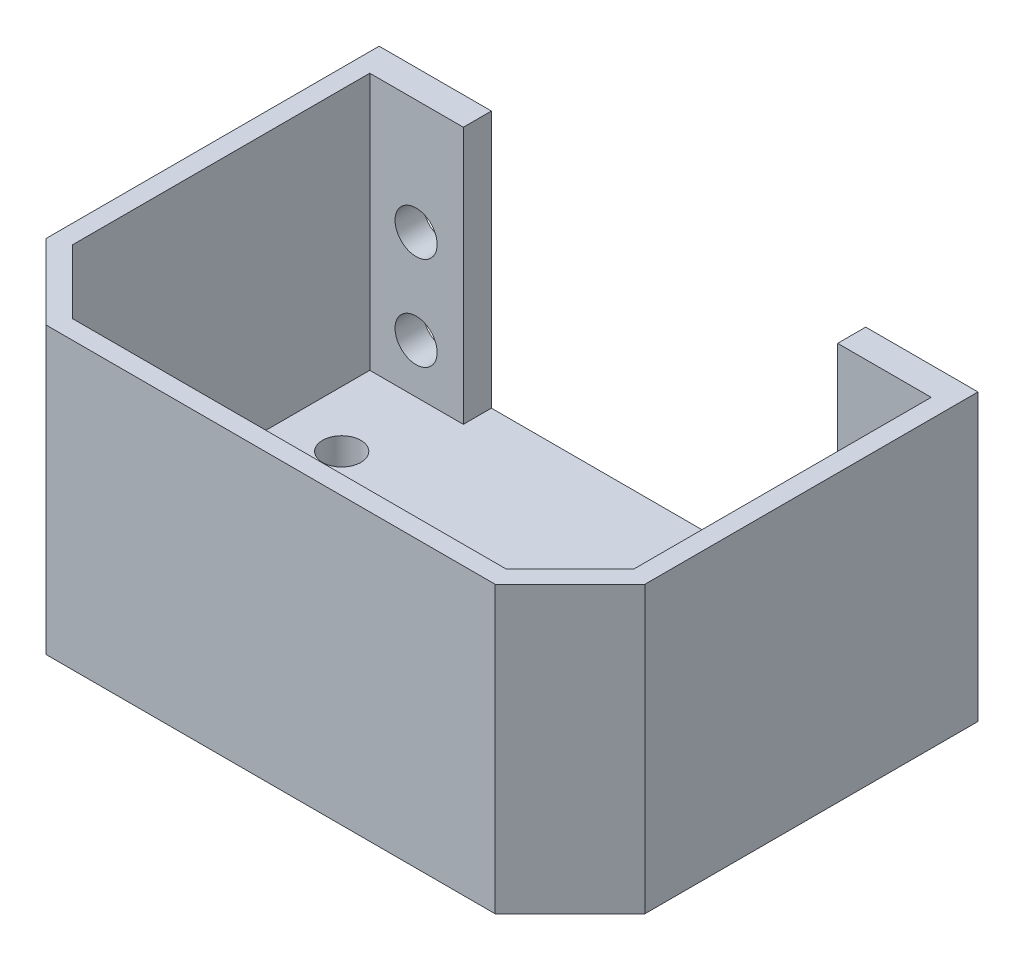
ISO-10303-21;
HEADER;
FILE_DESCRIPTION(('STEP AP214'),'2;1');
FILE_NAME('part.step','',(''),(''),'','','');
FILE_SCHEMA(('AUTOMOTIVE_DESIGN { 1 0 10303 214 1 1 1 1 }'));
ENDSEC;
DATA;
#1=APPLICATION_CONTEXT('core data for automotive mechanical design processes');
#2=APPLICATION_PROTOCOL_DEFINITION('international standard','automotive_design',2000,#1);
#3=PRODUCT_CONTEXT('',#1,'mechanical');
#4=PRODUCT('Part','Part','',(#3));
#5=PRODUCT_RELATED_PRODUCT_CATEGORY('part','',(#4));
#6=PRODUCT_DEFINITION_FORMATION('','',#4);
#7=PRODUCT_DEFINITION_CONTEXT('part definition',#1,'design');
#8=PRODUCT_DEFINITION('design','',#6,#7);
#9=PRODUCT_DEFINITION_SHAPE('','',#8);
#10=(LENGTH_UNIT() NAMED_UNIT(*) SI_UNIT(.MILLI.,.METRE.));
#11=(NAMED_UNIT(*) PLANE_ANGLE_UNIT() SI_UNIT($,.RADIAN.));
#12=(NAMED_UNIT(*) SI_UNIT($,.STERADIAN.) SOLID_ANGLE_UNIT());
#13=UNCERTAINTY_MEASURE_WITH_UNIT(LENGTH_MEASURE(1.E-05),#10,'distance_accuracy_value','');
#14=(GEOMETRIC_REPRESENTATION_CONTEXT(3) GLOBAL_UNCERTAINTY_ASSIGNED_CONTEXT((#13)) GLOBAL_UNIT_ASSIGNED_CONTEXT((#10,
#11,#12)) REPRESENTATION_CONTEXT('',''));
#15=CARTESIAN_POINT('',(0.,0.,0.));
#16=DIRECTION('',(0.,0.,1.));
#17=DIRECTION('',(1.,0.,0.));
#18=AXIS2_PLACEMENT_3D('',#15,#16,#17);
#19=CARTESIAN_POINT('',(32.,-10.25,28.));
#20=DIRECTION('',(0.,1.,0.));
#21=DIRECTION('',(0.,0.,1.));
#22=AXIS2_PLACEMENT_3D('',#19,#20,#21);
#23=PLANE('',#22);
#24=DIRECTION('',(0.,0.,-1.));
#25=VECTOR('',#24,1.);
#26=CARTESIAN_POINT('',(28.,-10.25,28.));
#27=LINE('',#26,#25);
#28=CARTESIAN_POINT('',(28.,-10.25,26.5142135623731));
#29=VERTEX_POINT('',#28);
#30=CARTESIAN_POINT('',(28.,-10.25,18.1));
#31=VERTEX_POINT('',#30);
#32=EDGE_CURVE('E336',#29,#31,#27,.T.);
#33=ORIENTED_EDGE('',*,*,#32,.F.);
#34=DIRECTION('',(0.707106781186544,0.,-0.70710678118655));
#35=VECTOR('',#34,1.);
#36=CARTESIAN_POINT('',(28.,-10.25,26.5142135623731));
#37=LINE('',#36,#35);
#38=CARTESIAN_POINT('',(25.9142135623731,-10.25,28.6));
#39=VERTEX_POINT('',#38);
#40=EDGE_CURVE('E302',#39,#29,#37,.T.);
#41=ORIENTED_EDGE('',*,*,#40,.F.);
#42=DIRECTION('',(1.,0.,0.));
#43=VECTOR('',#42,1.);
#44=CARTESIAN_POINT('',(25.9142135623731,-10.25,28.6));
#45=LINE('',#44,#43);
#46=CARTESIAN_POINT('',(-5.91421356237307,-10.25,28.6));
#47=VERTEX_POINT('',#46);
#48=EDGE_CURVE('E299',#47,#39,#45,.T.);
#49=ORIENTED_EDGE('',*,*,#48,.F.);
#50=DIRECTION('',(0.70710678118655,0.,0.707106781186545));
#51=VECTOR('',#50,1.);
#52=CARTESIAN_POINT('',(-5.91421356237307,-10.25,28.6));
#53=LINE('',#52,#51);
#54=CARTESIAN_POINT('',(-8.,-10.25,26.5142135623731));
#55=VERTEX_POINT('',#54);
#56=EDGE_CURVE('E296',#55,#47,#53,.T.);
#57=ORIENTED_EDGE('',*,*,#56,.F.);
#58=DIRECTION('',(0.,0.,1.));
#59=VECTOR('',#58,1.);
#60=CARTESIAN_POINT('',(-8.,-10.25,28.));
#61=LINE('',#60,#59);
#62=CARTESIAN_POINT('',(-8.,-10.25,18.1));
#63=VERTEX_POINT('',#62);
#64=EDGE_CURVE('E339',#63,#55,#61,.T.);
#65=ORIENTED_EDGE('',*,*,#64,.F.);
#66=DIRECTION('',(0.707106781186543,0.,-0.707106781186552));
#67=VECTOR('',#66,1.);
#68=CARTESIAN_POINT('',(-8.,-10.25,18.1));
#69=LINE('',#68,#67);
#70=CARTESIAN_POINT('',(-5.5,-10.25,15.6));
#71=VERTEX_POINT('',#70);
#72=EDGE_CURVE('E426',#63,#71,#69,.T.);
#73=ORIENTED_EDGE('',*,*,#72,.T.);
#74=DIRECTION('',(1.,0.,0.));
#75=VECTOR('',#74,1.);
#76=CARTESIAN_POINT('',(28.,-10.25,15.6));
#77=LINE('',#76,#75);
#78=CARTESIAN_POINT('',(25.5,-10.25,15.6));
#79=VERTEX_POINT('',#78);
#80=EDGE_CURVE('E322',#71,#79,#77,.T.);
#81=ORIENTED_EDGE('',*,*,#80,.T.);
#82=DIRECTION('',(0.707106781186551,0.,0.707106781186544));
#83=VECTOR('',#82,1.);
#84=CARTESIAN_POINT('',(25.5,-10.25,15.6));
#85=LINE('',#84,#83);
#86=EDGE_CURVE('E430',#79,#31,#85,.T.);
#87=ORIENTED_EDGE('',*,*,#86,.T.);
#88=EDGE_LOOP('',(#33,#41,#49,#57,#65,#73,#81,#87));
#89=FACE_BOUND('',#88,.T.);
#90=CARTESIAN_POINT('',(-24.,-10.25,31.6));
#91=DIRECTION('',(0.,-1.,0.));
#92=DIRECTION('',(0.,0.,-1.));
#93=AXIS2_PLACEMENT_3D('',#90,#91,#92);
#94=CIRCLE('',#93,2.05);
#95=CARTESIAN_POINT('',(-24.,-10.25,29.55));
#96=VERTEX_POINT('',#95);
#97=EDGE_CURVE('E316',#96,#96,#94,.T.);
#98=ORIENTED_EDGE('',*,*,#97,.T.);
#99=EDGE_LOOP('',(#98));
#100=FACE_BOUND('',#99,.T.);
#101=CARTESIAN_POINT('',(24.,-10.25,33.6));
#102=DIRECTION('',(0.,-1.,0.));
#103=DIRECTION('',(0.,0.,-1.));
#104=AXIS2_PLACEMENT_3D('',#101,#102,#103);
#105=CIRCLE('',#104,2.05);
#106=CARTESIAN_POINT('',(24.,-10.25,31.55));
#107=VERTEX_POINT('',#106);
#108=EDGE_CURVE('E309',#107,#107,#105,.T.);
#109=ORIENTED_EDGE('',*,*,#108,.T.);
#110=EDGE_LOOP('',(#109));
#111=FACE_BOUND('',#110,.T.);
#112=CARTESIAN_POINT('',(-24.,-10.25,12.));
#113=DIRECTION('',(0.,1.,0.));
#114=DIRECTION('',(0.,0.,1.));
#115=AXIS2_PLACEMENT_3D('',#112,#113,#114);
#116=CIRCLE('',#115,2.05);
#117=CARTESIAN_POINT('',(-24.,-10.25,14.05));
#118=VERTEX_POINT('',#117);
#119=EDGE_CURVE('E330',#118,#118,#116,.T.);
#120=ORIENTED_EDGE('',*,*,#119,.F.);
#121=EDGE_LOOP('',(#120));
#122=FACE_BOUND('',#121,.T.);
#123=CARTESIAN_POINT('',(24.,-10.25,10.));
#124=DIRECTION('',(0.,1.,0.));
#125=DIRECTION('',(0.,0.,1.));
#126=AXIS2_PLACEMENT_3D('',#123,#124,#125);
#127=CIRCLE('',#126,2.05);
#128=CARTESIAN_POINT('',(24.,-10.25,12.05));
#129=VERTEX_POINT('',#128);
#130=EDGE_CURVE('E329',#129,#129,#127,.T.);
#131=ORIENTED_EDGE('',*,*,#130,.F.);
#132=EDGE_LOOP('',(#131));
#133=FACE_BOUND('',#132,.T.);
#134=DIRECTION('',(-0.707106781187019,0.,0.707106781186076));
#135=VECTOR('',#134,1.);
#136=CARTESIAN_POINT('',(23.1715728752653,-10.25,41.6));
#137=LINE('',#136,#135);
#138=CARTESIAN_POINT('',(30.0000000000107,-10.25,34.7715728752637));
#139=VERTEX_POINT('',#138);
#140=CARTESIAN_POINT('',(23.1715728752653,-10.25,41.6));
#141=VERTEX_POINT('',#140);
#142=EDGE_CURVE('E286',#139,#141,#137,.T.);
#143=ORIENTED_EDGE('',*,*,#142,.F.);
#144=DIRECTION('',(0.,0.,1.));
#145=VECTOR('',#144,1.);
#146=CARTESIAN_POINT('',(30.,-10.25,28.));
#147=LINE('',#146,#145);
#148=CARTESIAN_POINT('',(30.,-10.25,3.));
#149=VERTEX_POINT('',#148);
#150=EDGE_CURVE('E65',#149,#139,#147,.T.);
#151=ORIENTED_EDGE('',*,*,#150,.F.);
#152=DIRECTION('',(-1.,0.,0.));
#153=VECTOR('',#152,1.);
#154=CARTESIAN_POINT('',(0.,-10.25,3.));
#155=LINE('',#154,#153);
#156=CARTESIAN_POINT('',(20.,-10.25,3.));
#157=VERTEX_POINT('',#156);
#158=EDGE_CURVE('E370',#149,#157,#155,.T.);
#159=ORIENTED_EDGE('',*,*,#158,.T.);
#160=DIRECTION('',(0.,0.,-1.));
#161=VECTOR('',#160,1.);
#162=CARTESIAN_POINT('',(20.,-10.25,3.));
#163=LINE('',#162,#161);
#164=CARTESIAN_POINT('',(20.,-10.25,0.));
#165=VERTEX_POINT('',#164);
#166=EDGE_CURVE('E372',#157,#165,#163,.T.);
#167=ORIENTED_EDGE('',*,*,#166,.T.);
#168=DIRECTION('',(1.,0.,0.));
#169=VECTOR('',#168,1.);
#170=CARTESIAN_POINT('',(32.,-10.25,0.));
#171=LINE('',#170,#169);
#172=CARTESIAN_POINT('',(-20.,-10.25,0.));
#173=VERTEX_POINT('',#172);
#174=EDGE_CURVE('E381',#173,#165,#171,.T.);
#175=ORIENTED_EDGE('',*,*,#174,.F.);
#176=DIRECTION('',(0.,0.,-1.));
#177=VECTOR('',#176,1.);
#178=CARTESIAN_POINT('',(-20.,-10.25,3.));
#179=LINE('',#178,#177);
#180=CARTESIAN_POINT('',(-20.,-10.25,3.));
#181=VERTEX_POINT('',#180);
#182=EDGE_CURVE('E216',#181,#173,#179,.T.);
#183=ORIENTED_EDGE('',*,*,#182,.F.);
#184=DIRECTION('',(-1.,0.,0.));
#185=VECTOR('',#184,1.);
#186=CARTESIAN_POINT('',(0.,-10.25,3.));
#187=LINE('',#186,#185);
#188=CARTESIAN_POINT('',(-30.,-10.25,3.));
#189=VERTEX_POINT('',#188);
#190=EDGE_CURVE('E400',#181,#189,#187,.T.);
#191=ORIENTED_EDGE('',*,*,#190,.T.);
#192=DIRECTION('',(0.,0.,1.));
#193=VECTOR('',#192,1.);
#194=CARTESIAN_POINT('',(-30.,-10.25,28.));
#195=LINE('',#194,#193);
#196=CARTESIAN_POINT('',(-30.,-10.25,34.7715728752538));
#197=VERTEX_POINT('',#196);
#198=EDGE_CURVE('E352',#189,#197,#195,.T.);
#199=ORIENTED_EDGE('',*,*,#198,.T.);
#200=DIRECTION('',(-0.707106781186547,0.,-0.707106781186547));
#201=VECTOR('',#200,1.);
#202=CARTESIAN_POINT('',(-30.,-10.25,34.7715728752538));
#203=LINE('',#202,#201);
#204=CARTESIAN_POINT('',(-23.1715728752538,-10.25,41.6));
#205=VERTEX_POINT('',#204);
#206=EDGE_CURVE('E279',#205,#197,#203,.T.);
#207=ORIENTED_EDGE('',*,*,#206,.F.);
#208=DIRECTION('',(-1.,0.,0.));
#209=VECTOR('',#208,1.);
#210=CARTESIAN_POINT('',(-23.1715728752538,-10.25,41.6));
#211=LINE('',#210,#209);
#212=EDGE_CURVE('E72',#141,#205,#211,.T.);
#213=ORIENTED_EDGE('',*,*,#212,.F.);
#214=EDGE_LOOP('',(#143,#151,#159,#167,#175,#183,#191,#199,#207,#213));
#215=FACE_BOUND('',#214,.T.);
#216=ADVANCED_FACE('F49',(#89,#100,#111,#122,#133,#215),#23,.T.);
#217=CARTESIAN_POINT('',(32.,-13.25,28.));
#218=DIRECTION('',(0.,-1.,0.));
#219=DIRECTION('',(0.,0.,-1.));
#220=AXIS2_PLACEMENT_3D('',#217,#218,#219);
#221=PLANE('',#220);
#222=DIRECTION('',(-0.707106781186545,0.,0.70710678118655));
#223=VECTOR('',#222,1.);
#224=CARTESIAN_POINT('',(29.2571067811865,-13.25,25.2571067811866));
#225=LINE('',#224,#223);
#226=CARTESIAN_POINT('',(28.,-13.25,26.5142135623731));
#227=VERTEX_POINT('',#226);
#228=CARTESIAN_POINT('',(25.9142135623731,-13.25,28.6));
#229=VERTEX_POINT('',#228);
#230=EDGE_CURVE('E11',#227,#229,#225,.T.);
#231=ORIENTED_EDGE('',*,*,#230,.F.);
#232=DIRECTION('',(0.,0.,1.));
#233=VECTOR('',#232,1.);
#234=CARTESIAN_POINT('',(28.,-13.25,28.));
#235=LINE('',#234,#233);
#236=CARTESIAN_POINT('',(28.,-13.25,18.1));
#237=VERTEX_POINT('',#236);
#238=EDGE_CURVE('E345',#237,#227,#235,.T.);
#239=ORIENTED_EDGE('',*,*,#238,.F.);
#240=DIRECTION('',(-0.707106781186551,0.,-0.707106781186544));
#241=VECTOR('',#240,1.);
#242=CARTESIAN_POINT('',(25.5,-13.25,15.6));
#243=LINE('',#242,#241);
#244=CARTESIAN_POINT('',(25.5,-13.25,15.6));
#245=VERTEX_POINT('',#244);
#246=EDGE_CURVE('E432',#237,#245,#243,.T.);
#247=ORIENTED_EDGE('',*,*,#246,.T.);
#248=DIRECTION('',(-1.,0.,0.));
#249=VECTOR('',#248,1.);
#250=CARTESIAN_POINT('',(32.,-13.25,15.6));
#251=LINE('',#250,#249);
#252=CARTESIAN_POINT('',(-5.5,-13.25,15.6));
#253=VERTEX_POINT('',#252);
#254=EDGE_CURVE('E405',#245,#253,#251,.T.);
#255=ORIENTED_EDGE('',*,*,#254,.T.);
#256=DIRECTION('',(-0.707106781186543,0.,0.707106781186552));
#257=VECTOR('',#256,1.);
#258=CARTESIAN_POINT('',(-8.,-13.25,18.1));
#259=LINE('',#258,#257);
#260=CARTESIAN_POINT('',(-8.,-13.25,18.1));
#261=VERTEX_POINT('',#260);
#262=EDGE_CURVE('E428',#253,#261,#259,.T.);
#263=ORIENTED_EDGE('',*,*,#262,.T.);
#264=DIRECTION('',(0.,0.,-1.));
#265=VECTOR('',#264,1.);
#266=CARTESIAN_POINT('',(-8.,-13.25,28.));
#267=LINE('',#266,#265);
#268=CARTESIAN_POINT('',(-8.,-13.25,26.5142135623731));
#269=VERTEX_POINT('',#268);
#270=EDGE_CURVE('E342',#269,#261,#267,.T.);
#271=ORIENTED_EDGE('',*,*,#270,.F.);
#272=DIRECTION('',(-0.70710678118655,0.,-0.707106781186545));
#273=VECTOR('',#272,1.);
#274=CARTESIAN_POINT('',(12.7428932188136,-13.25,47.2571067811865));
#275=LINE('',#274,#273);
#276=CARTESIAN_POINT('',(-5.91421356237307,-13.25,28.6));
#277=VERTEX_POINT('',#276);
#278=EDGE_CURVE('E446',#277,#269,#275,.T.);
#279=ORIENTED_EDGE('',*,*,#278,.F.);
#280=DIRECTION('',(-1.,0.,0.));
#281=VECTOR('',#280,1.);
#282=CARTESIAN_POINT('',(32.,-13.25,28.6));
#283=LINE('',#282,#281);
#284=EDGE_CURVE('E58',#229,#277,#283,.T.);
#285=ORIENTED_EDGE('',*,*,#284,.F.);
#286=EDGE_LOOP('',(#231,#239,#247,#255,#263,#271,#279,#285));
#287=FACE_BOUND('',#286,.T.);
#288=CARTESIAN_POINT('',(-24.,-13.25,31.6));
#289=DIRECTION('',(0.,-1.,0.));
#290=DIRECTION('',(0.,0.,-1.));
#291=AXIS2_PLACEMENT_3D('',#288,#289,#290);
#292=CIRCLE('',#291,2.05);
#293=CARTESIAN_POINT('',(-24.,-13.25,29.55));
#294=VERTEX_POINT('',#293);
#295=EDGE_CURVE('E326',#294,#294,#292,.F.);
#296=ORIENTED_EDGE('',*,*,#295,.T.);
#297=EDGE_LOOP('',(#296));
#298=FACE_BOUND('',#297,.T.);
#299=CARTESIAN_POINT('',(24.,-13.25,33.6));
#300=DIRECTION('',(0.,-1.,0.));
#301=DIRECTION('',(0.,0.,-1.));
#302=AXIS2_PLACEMENT_3D('',#299,#300,#301);
#303=CIRCLE('',#302,2.05);
#304=CARTESIAN_POINT('',(24.,-13.25,31.55));
#305=VERTEX_POINT('',#304);
#306=EDGE_CURVE('E319',#305,#305,#303,.F.);
#307=ORIENTED_EDGE('',*,*,#306,.T.);
#308=EDGE_LOOP('',(#307));
#309=FACE_BOUND('',#308,.T.);
#310=DIRECTION('',(1.,0.,0.));
#311=VECTOR('',#310,1.);
#312=CARTESIAN_POINT('',(-32.,-13.25,43.6));
#313=LINE('',#312,#311);
#314=CARTESIAN_POINT('',(-24.,-13.25,43.6));
#315=VERTEX_POINT('',#314);
#316=CARTESIAN_POINT('',(24.0000000000107,-13.25,43.6));
#317=VERTEX_POINT('',#316);
#318=EDGE_CURVE('E325',#315,#317,#313,.T.);
#319=ORIENTED_EDGE('',*,*,#318,.F.);
#320=DIRECTION('',(0.707106781186549,0.,0.707106781186547));
#321=VECTOR('',#320,1.);
#322=CARTESIAN_POINT('',(-3.79999999999991,-13.25,63.8));
#323=LINE('',#322,#321);
#324=CARTESIAN_POINT('',(-32.,-13.25,35.6));
#325=VERTEX_POINT('',#324);
#326=EDGE_CURVE('E442',#315,#325,#323,.F.);
#327=ORIENTED_EDGE('',*,*,#326,.T.);
#328=DIRECTION('',(0.,0.,-1.));
#329=VECTOR('',#328,1.);
#330=CARTESIAN_POINT('',(-32.,-13.25,28.));
#331=LINE('',#330,#329);
#332=CARTESIAN_POINT('',(-32.,-13.25,0.));
#333=VERTEX_POINT('',#332);
#334=EDGE_CURVE('E384',#325,#333,#331,.T.);
#335=ORIENTED_EDGE('',*,*,#334,.T.);
#336=DIRECTION('',(-1.,0.,0.));
#337=VECTOR('',#336,1.);
#338=CARTESIAN_POINT('',(32.,-13.25,0.));
#339=LINE('',#338,#337);
#340=CARTESIAN_POINT('',(32.,-13.25,0.));
#341=VERTEX_POINT('',#340);
#342=EDGE_CURVE('E379',#341,#333,#339,.T.);
#343=ORIENTED_EDGE('',*,*,#342,.F.);
#344=DIRECTION('',(0.,0.,-1.));
#345=VECTOR('',#344,1.);
#346=CARTESIAN_POINT('',(32.,-13.25,28.));
#347=LINE('',#346,#345);
#348=CARTESIAN_POINT('',(32.,-13.25,35.6000000000107));
#349=VERTEX_POINT('',#348);
#350=EDGE_CURVE('E383',#349,#341,#347,.T.);
#351=ORIENTED_EDGE('',*,*,#350,.F.);
#352=DIRECTION('',(0.707106781186547,0.,-0.707106781186548));
#353=VECTOR('',#352,1.);
#354=CARTESIAN_POINT('',(35.8000000000053,-13.25,31.8000000000053));
#355=LINE('',#354,#353);
#356=EDGE_CURVE('E440',#349,#317,#355,.F.);
#357=ORIENTED_EDGE('',*,*,#356,.T.);
#358=EDGE_LOOP('',(#319,#327,#335,#343,#351,#357));
#359=FACE_BOUND('',#358,.T.);
#360=CARTESIAN_POINT('',(-24.,-13.25,12.));
#361=DIRECTION('',(0.,-1.,0.));
#362=DIRECTION('',(0.,0.,-1.));
#363=AXIS2_PLACEMENT_3D('',#360,#361,#362);
#364=CIRCLE('',#363,2.05);
#365=CARTESIAN_POINT('',(-24.,-13.25,9.95));
#366=VERTEX_POINT('',#365);
#367=EDGE_CURVE('E340',#366,#366,#364,.T.);
#368=ORIENTED_EDGE('',*,*,#367,.F.);
#369=EDGE_LOOP('',(#368));
#370=FACE_BOUND('',#369,.T.);
#371=CARTESIAN_POINT('',(24.,-13.25,10.));
#372=DIRECTION('',(0.,-1.,0.));
#373=DIRECTION('',(0.,0.,-1.));
#374=AXIS2_PLACEMENT_3D('',#371,#372,#373);
#375=CIRCLE('',#374,2.05);
#376=CARTESIAN_POINT('',(24.,-13.25,7.95));
#377=VERTEX_POINT('',#376);
#378=EDGE_CURVE('E333',#377,#377,#375,.T.);
#379=ORIENTED_EDGE('',*,*,#378,.F.);
#380=EDGE_LOOP('',(#379));
#381=FACE_BOUND('',#380,.T.);
#382=ADVANCED_FACE('F461',(#287,#298,#309,#359,#370,#381),#221,.T.);
#383=CARTESIAN_POINT('',(0.,0.,3.));
#384=DIRECTION('',(0.,0.,1.));
#385=DIRECTION('',(1.,0.,0.));
#386=AXIS2_PLACEMENT_3D('',#383,#384,#385);
#387=PLANE('',#386);
#388=CARTESIAN_POINT('',(25.05,-5.,3.));
#389=DIRECTION('',(0.,0.,1.));
#390=DIRECTION('',(1.,0.,0.));
#391=AXIS2_PLACEMENT_3D('',#388,#389,#390);
#392=CIRCLE('',#391,2.25);
#393=CARTESIAN_POINT('',(27.3,-5.,3.));
#394=VERTEX_POINT('',#393);
#395=EDGE_CURVE('E363',#394,#394,#392,.F.);
#396=ORIENTED_EDGE('',*,*,#395,.T.);
#397=EDGE_LOOP('',(#396));
#398=FACE_BOUND('',#397,.T.);
#399=CARTESIAN_POINT('',(25.05,5.,3.));
#400=DIRECTION('',(0.,0.,1.));
#401=DIRECTION('',(1.,0.,0.));
#402=AXIS2_PLACEMENT_3D('',#399,#400,#401);
#403=CIRCLE('',#402,2.25);
#404=CARTESIAN_POINT('',(27.3,5.,3.));
#405=VERTEX_POINT('',#404);
#406=EDGE_CURVE('E358',#405,#405,#403,.F.);
#407=ORIENTED_EDGE('',*,*,#406,.T.);
#408=EDGE_LOOP('',(#407));
#409=FACE_BOUND('',#408,.T.);
#410=ORIENTED_EDGE('',*,*,#158,.F.);
#411=DIRECTION('',(0.,-1.,0.));
#412=VECTOR('',#411,1.);
#413=CARTESIAN_POINT('',(30.,-10.25,3.));
#414=LINE('',#413,#412);
#415=CARTESIAN_POINT('',(30.,17.25,3.));
#416=VERTEX_POINT('',#415);
#417=EDGE_CURVE('E347',#416,#149,#414,.T.);
#418=ORIENTED_EDGE('',*,*,#417,.F.);
#419=DIRECTION('',(1.,0.,0.));
#420=VECTOR('',#419,1.);
#421=CARTESIAN_POINT('',(20.,17.25,3.));
#422=LINE('',#421,#420);
#423=CARTESIAN_POINT('',(20.,17.25,3.));
#424=VERTEX_POINT('',#423);
#425=EDGE_CURVE('E260',#424,#416,#422,.T.);
#426=ORIENTED_EDGE('',*,*,#425,.F.);
#427=DIRECTION('',(0.,-1.,0.));
#428=VECTOR('',#427,1.);
#429=CARTESIAN_POINT('',(20.,0.,3.));
#430=LINE('',#429,#428);
#431=EDGE_CURVE('E367',#424,#157,#430,.T.);
#432=ORIENTED_EDGE('',*,*,#431,.T.);
#433=EDGE_LOOP('',(#410,#418,#426,#432));
#434=FACE_BOUND('',#433,.T.);
#435=ADVANCED_FACE('F507',(#398,#409,#434),#387,.T.);
#436=CARTESIAN_POINT('',(0.,0.,3.));
#437=DIRECTION('',(0.,0.,1.));
#438=DIRECTION('',(1.,0.,0.));
#439=AXIS2_PLACEMENT_3D('',#436,#437,#438);
#440=PLANE('',#439);
#441=CARTESIAN_POINT('',(-25.05,5.,3.));
#442=DIRECTION('',(0.,0.,1.));
#443=DIRECTION('',(1.,0.,0.));
#444=AXIS2_PLACEMENT_3D('',#441,#442,#443);
#445=CIRCLE('',#444,2.25);
#446=CARTESIAN_POINT('',(-22.8,5.,3.));
#447=VERTEX_POINT('',#446);
#448=EDGE_CURVE('E221',#447,#447,#445,.T.);
#449=ORIENTED_EDGE('',*,*,#448,.F.);
#450=EDGE_LOOP('',(#449));
#451=FACE_BOUND('',#450,.T.);
#452=CARTESIAN_POINT('',(-25.05,-5.,3.));
#453=DIRECTION('',(0.,0.,1.));
#454=DIRECTION('',(1.,0.,0.));
#455=AXIS2_PLACEMENT_3D('',#452,#453,#454);
#456=CIRCLE('',#455,2.25);
#457=CARTESIAN_POINT('',(-22.8,-5.,3.));
#458=VERTEX_POINT('',#457);
#459=EDGE_CURVE('E391',#458,#458,#456,.T.);
#460=ORIENTED_EDGE('',*,*,#459,.F.);
#461=EDGE_LOOP('',(#460));
#462=FACE_BOUND('',#461,.T.);
#463=DIRECTION('',(0.,-1.,0.));
#464=VECTOR('',#463,1.);
#465=CARTESIAN_POINT('',(-20.,0.,3.));
#466=LINE('',#465,#464);
#467=CARTESIAN_POINT('',(-20.,17.25,3.));
#468=VERTEX_POINT('',#467);
#469=EDGE_CURVE('E398',#468,#181,#466,.T.);
#470=ORIENTED_EDGE('',*,*,#469,.F.);
#471=DIRECTION('',(1.,0.,0.));
#472=VECTOR('',#471,1.);
#473=CARTESIAN_POINT('',(-30.,17.25,3.));
#474=LINE('',#473,#472);
#475=CARTESIAN_POINT('',(-30.,17.25,3.));
#476=VERTEX_POINT('',#475);
#477=EDGE_CURVE('E238',#476,#468,#474,.T.);
#478=ORIENTED_EDGE('',*,*,#477,.F.);
#479=DIRECTION('',(0.,-1.,0.));
#480=VECTOR('',#479,1.);
#481=CARTESIAN_POINT('',(-30.,-10.25,3.));
#482=LINE('',#481,#480);
#483=EDGE_CURVE('E350',#476,#189,#482,.T.);
#484=ORIENTED_EDGE('',*,*,#483,.T.);
#485=ORIENTED_EDGE('',*,*,#190,.F.);
#486=EDGE_LOOP('',(#470,#478,#484,#485));
#487=FACE_BOUND('',#486,.T.);
#488=ADVANCED_FACE('F525',(#451,#462,#487),#440,.T.);
#489=CARTESIAN_POINT('',(-20.,0.,3.));
#490=DIRECTION('',(1.,0.,0.));
#491=DIRECTION('',(0.,0.,-1.));
#492=AXIS2_PLACEMENT_3D('',#489,#490,#491);
#493=PLANE('',#492);
#494=DIRECTION('',(0.,-1.,0.));
#495=VECTOR('',#494,1.);
#496=CARTESIAN_POINT('',(-20.,0.,0.));
#497=LINE('',#496,#495);
#498=CARTESIAN_POINT('',(-20.,17.25,0.));
#499=VERTEX_POINT('',#498);
#500=EDGE_CURVE('E210',#499,#173,#497,.T.);
#501=ORIENTED_EDGE('',*,*,#500,.F.);
#502=DIRECTION('',(0.,0.,-1.));
#503=VECTOR('',#502,1.);
#504=CARTESIAN_POINT('',(-20.,17.25,3.));
#505=LINE('',#504,#503);
#506=EDGE_CURVE('E214',#468,#499,#505,.T.);
#507=ORIENTED_EDGE('',*,*,#506,.F.);
#508=ORIENTED_EDGE('',*,*,#469,.T.);
#509=ORIENTED_EDGE('',*,*,#182,.T.);
#510=EDGE_LOOP('',(#501,#507,#508,#509));
#511=FACE_BOUND('',#510,.T.);
#512=ADVANCED_FACE('F212',(#511),#493,.T.);
#513=CARTESIAN_POINT('',(-32.,0.,3.));
#514=DIRECTION('',(-1.,0.,0.));
#515=DIRECTION('',(0.,0.,1.));
#516=AXIS2_PLACEMENT_3D('',#513,#514,#515);
#517=PLANE('',#516);
#518=DIRECTION('',(0.,1.,0.));
#519=VECTOR('',#518,1.);
#520=CARTESIAN_POINT('',(-32.,0.,35.6));
#521=LINE('',#520,#519);
#522=CARTESIAN_POINT('',(-32.,17.25,35.6));
#523=VERTEX_POINT('',#522);
#524=EDGE_CURVE('E434',#325,#523,#521,.T.);
#525=ORIENTED_EDGE('',*,*,#524,.T.);
#526=DIRECTION('',(0.,0.,1.));
#527=VECTOR('',#526,1.);
#528=CARTESIAN_POINT('',(-32.,17.25,0.));
#529=LINE('',#528,#527);
#530=CARTESIAN_POINT('',(-32.,17.25,0.));
#531=VERTEX_POINT('',#530);
#532=EDGE_CURVE('E232',#531,#523,#529,.T.);
#533=ORIENTED_EDGE('',*,*,#532,.F.);
#534=DIRECTION('',(0.,1.,0.));
#535=VECTOR('',#534,1.);
#536=CARTESIAN_POINT('',(-32.,0.,0.));
#537=LINE('',#536,#535);
#538=EDGE_CURVE('E220',#333,#531,#537,.T.);
#539=ORIENTED_EDGE('',*,*,#538,.F.);
#540=ORIENTED_EDGE('',*,*,#334,.F.);
#541=EDGE_LOOP('',(#525,#533,#539,#540));
#542=FACE_BOUND('',#541,.T.);
#543=ADVANCED_FACE('F531',(#542),#517,.T.);
#544=CARTESIAN_POINT('',(0.,0.,0.));
#545=DIRECTION('',(0.,0.,1.));
#546=DIRECTION('',(1.,0.,0.));
#547=AXIS2_PLACEMENT_3D('',#544,#545,#546);
#548=PLANE('',#547);
#549=CARTESIAN_POINT('',(-25.05,5.,0.));
#550=DIRECTION('',(0.,0.,1.));
#551=DIRECTION('',(1.,0.,0.));
#552=AXIS2_PLACEMENT_3D('',#549,#550,#551);
#553=CIRCLE('',#552,2.25);
#554=CARTESIAN_POINT('',(-22.8,5.,0.));
#555=VERTEX_POINT('',#554);
#556=EDGE_CURVE('E388',#555,#555,#553,.T.);
#557=ORIENTED_EDGE('',*,*,#556,.T.);
#558=EDGE_LOOP('',(#557));
#559=FACE_BOUND('',#558,.T.);
#560=CARTESIAN_POINT('',(-25.05,-5.,0.));
#561=DIRECTION('',(0.,0.,1.));
#562=DIRECTION('',(1.,0.,0.));
#563=AXIS2_PLACEMENT_3D('',#560,#561,#562);
#564=CIRCLE('',#563,2.25);
#565=CARTESIAN_POINT('',(-22.8,-5.,0.));
#566=VERTEX_POINT('',#565);
#567=EDGE_CURVE('E386',#566,#566,#564,.T.);
#568=ORIENTED_EDGE('',*,*,#567,.T.);
#569=EDGE_LOOP('',(#568));
#570=FACE_BOUND('',#569,.T.);
#571=ORIENTED_EDGE('',*,*,#500,.T.);
#572=ORIENTED_EDGE('',*,*,#174,.T.);
#573=DIRECTION('',(0.,-1.,0.));
#574=VECTOR('',#573,1.);
#575=CARTESIAN_POINT('',(20.,0.,0.));
#576=LINE('',#575,#574);
#577=CARTESIAN_POINT('',(20.,17.25,0.));
#578=VERTEX_POINT('',#577);
#579=EDGE_CURVE('E366',#578,#165,#576,.T.);
#580=ORIENTED_EDGE('',*,*,#579,.F.);
#581=DIRECTION('',(-1.,0.,0.));
#582=VECTOR('',#581,1.);
#583=CARTESIAN_POINT('',(32.,17.25,0.));
#584=LINE('',#583,#582);
#585=CARTESIAN_POINT('',(32.,17.25,0.));
#586=VERTEX_POINT('',#585);
#587=EDGE_CURVE('E254',#586,#578,#584,.T.);
#588=ORIENTED_EDGE('',*,*,#587,.F.);
#589=DIRECTION('',(0.,-1.,0.));
#590=VECTOR('',#589,1.);
#591=CARTESIAN_POINT('',(32.,-10.25,0.));
#592=LINE('',#591,#590);
#593=EDGE_CURVE('E376',#586,#341,#592,.T.);
#594=ORIENTED_EDGE('',*,*,#593,.T.);
#595=ORIENTED_EDGE('',*,*,#342,.T.);
#596=ORIENTED_EDGE('',*,*,#538,.T.);
#597=DIRECTION('',(-1.,0.,0.));
#598=VECTOR('',#597,1.);
#599=CARTESIAN_POINT('',(-20.,17.25,0.));
#600=LINE('',#599,#598);
#601=EDGE_CURVE('E224',#499,#531,#600,.T.);
#602=ORIENTED_EDGE('',*,*,#601,.F.);
#603=EDGE_LOOP('',(#571,#572,#580,#588,#594,#595,#596,#602));
#604=FACE_BOUND('',#603,.T.);
#605=CARTESIAN_POINT('',(25.05,-5.,0.));
#606=DIRECTION('',(0.,0.,1.));
#607=DIRECTION('',(1.,0.,0.));
#608=AXIS2_PLACEMENT_3D('',#605,#606,#607);
#609=CIRCLE('',#608,2.25);
#610=CARTESIAN_POINT('',(27.3,-5.,0.));
#611=VERTEX_POINT('',#610);
#612=EDGE_CURVE('E355',#611,#611,#609,.F.);
#613=ORIENTED_EDGE('',*,*,#612,.F.);
#614=EDGE_LOOP('',(#613));
#615=FACE_BOUND('',#614,.T.);
#616=CARTESIAN_POINT('',(25.05,5.,0.));
#617=DIRECTION('',(0.,0.,1.));
#618=DIRECTION('',(1.,0.,0.));
#619=AXIS2_PLACEMENT_3D('',#616,#617,#618);
#620=CIRCLE('',#619,2.25);
#621=CARTESIAN_POINT('',(27.3,5.,0.));
#622=VERTEX_POINT('',#621);
#623=EDGE_CURVE('E354',#622,#622,#620,.F.);
#624=ORIENTED_EDGE('',*,*,#623,.F.);
#625=EDGE_LOOP('',(#624));
#626=FACE_BOUND('',#625,.T.);
#627=ADVANCED_FACE('F225',(#559,#570,#604,#615,#626),#548,.F.);
#628=CARTESIAN_POINT('',(-25.05,-5.,0.));
#629=DIRECTION('',(0.,0.,1.));
#630=DIRECTION('',(1.,0.,0.));
#631=AXIS2_PLACEMENT_3D('',#628,#629,#630);
#632=CYLINDRICAL_SURFACE('',#631,2.25);
#633=ORIENTED_EDGE('',*,*,#459,.T.);
#634=EDGE_LOOP('',(#633));
#635=FACE_BOUND('',#634,.T.);
#636=ORIENTED_EDGE('',*,*,#567,.F.);
#637=EDGE_LOOP('',(#636));
#638=FACE_BOUND('',#637,.T.);
#639=ADVANCED_FACE('F520',(#635,#638),#632,.F.);
#640=CARTESIAN_POINT('',(-25.05,5.,0.));
#641=DIRECTION('',(0.,0.,1.));
#642=DIRECTION('',(1.,0.,0.));
#643=AXIS2_PLACEMENT_3D('',#640,#641,#642);
#644=CYLINDRICAL_SURFACE('',#643,2.25);
#645=ORIENTED_EDGE('',*,*,#448,.T.);
#646=EDGE_LOOP('',(#645));
#647=FACE_BOUND('',#646,.T.);
#648=ORIENTED_EDGE('',*,*,#556,.F.);
#649=EDGE_LOOP('',(#648));
#650=FACE_BOUND('',#649,.T.);
#651=ADVANCED_FACE('F516',(#647,#650),#644,.F.);
#652=CARTESIAN_POINT('',(32.,-10.25,28.));
#653=DIRECTION('',(1.,0.,0.));
#654=DIRECTION('',(0.,0.,-1.));
#655=AXIS2_PLACEMENT_3D('',#652,#653,#654);
#656=PLANE('',#655);
#657=ORIENTED_EDGE('',*,*,#593,.F.);
#658=DIRECTION('',(-3.00165635168931E-13,0.,-1.));
#659=VECTOR('',#658,1.);
#660=CARTESIAN_POINT('',(32.0000000000107,17.25,35.6000000000107));
#661=LINE('',#660,#659);
#662=CARTESIAN_POINT('',(32.0000000000107,17.25,35.6000000000107));
#663=VERTEX_POINT('',#662);
#664=EDGE_CURVE('E251',#663,#586,#661,.T.);
#665=ORIENTED_EDGE('',*,*,#664,.F.);
#666=DIRECTION('',(0.,-1.,0.));
#667=VECTOR('',#666,1.);
#668=CARTESIAN_POINT('',(32.,-10.25,35.6000000000107));
#669=LINE('',#668,#667);
#670=EDGE_CURVE('E444',#663,#349,#669,.T.);
#671=ORIENTED_EDGE('',*,*,#670,.T.);
#672=ORIENTED_EDGE('',*,*,#350,.T.);
#673=EDGE_LOOP('',(#657,#665,#671,#672));
#674=FACE_BOUND('',#673,.T.);
#675=ADVANCED_FACE('F513',(#674),#656,.T.);
#676=CARTESIAN_POINT('',(20.,0.,3.));
#677=DIRECTION('',(1.,0.,0.));
#678=DIRECTION('',(0.,0.,-1.));
#679=AXIS2_PLACEMENT_3D('',#676,#677,#678);
#680=PLANE('',#679);
#681=ORIENTED_EDGE('',*,*,#579,.T.);
#682=ORIENTED_EDGE('',*,*,#166,.F.);
#683=ORIENTED_EDGE('',*,*,#431,.F.);
#684=DIRECTION('',(0.,0.,1.));
#685=VECTOR('',#684,1.);
#686=CARTESIAN_POINT('',(20.,17.25,0.));
#687=LINE('',#686,#685);
#688=EDGE_CURVE('E257',#578,#424,#687,.T.);
#689=ORIENTED_EDGE('',*,*,#688,.F.);
#690=EDGE_LOOP('',(#681,#682,#683,#689));
#691=FACE_BOUND('',#690,.T.);
#692=ADVANCED_FACE('F510',(#691),#680,.F.);
#693=CARTESIAN_POINT('',(25.05,5.,0.));
#694=DIRECTION('',(0.,0.,1.));
#695=DIRECTION('',(1.,0.,0.));
#696=AXIS2_PLACEMENT_3D('',#693,#694,#695);
#697=CYLINDRICAL_SURFACE('',#696,2.25);
#698=ORIENTED_EDGE('',*,*,#406,.F.);
#699=EDGE_LOOP('',(#698));
#700=FACE_BOUND('',#699,.T.);
#701=ORIENTED_EDGE('',*,*,#623,.T.);
#702=EDGE_LOOP('',(#701));
#703=FACE_BOUND('',#702,.T.);
#704=ADVANCED_FACE('F605',(#700,#703),#697,.F.);
#705=CARTESIAN_POINT('',(25.05,-5.,0.));
#706=DIRECTION('',(0.,0.,1.));
#707=DIRECTION('',(1.,0.,0.));
#708=AXIS2_PLACEMENT_3D('',#705,#706,#707);
#709=CYLINDRICAL_SURFACE('',#708,2.25);
#710=ORIENTED_EDGE('',*,*,#395,.F.);
#711=EDGE_LOOP('',(#710));
#712=FACE_BOUND('',#711,.T.);
#713=ORIENTED_EDGE('',*,*,#612,.T.);
#714=EDGE_LOOP('',(#713));
#715=FACE_BOUND('',#714,.T.);
#716=ADVANCED_FACE('F597',(#712,#715),#709,.F.);
#717=CARTESIAN_POINT('',(-30.,0.,0.));
#718=DIRECTION('',(-1.,0.,0.));
#719=DIRECTION('',(0.,0.,1.));
#720=AXIS2_PLACEMENT_3D('',#717,#718,#719);
#721=PLANE('',#720);
#722=ORIENTED_EDGE('',*,*,#483,.F.);
#723=DIRECTION('',(0.,0.,-1.));
#724=VECTOR('',#723,1.);
#725=CARTESIAN_POINT('',(-30.,17.25,34.7715728752538));
#726=LINE('',#725,#724);
#727=CARTESIAN_POINT('',(-30.,17.25,34.7715728752538));
#728=VERTEX_POINT('',#727);
#729=EDGE_CURVE('E275',#728,#476,#726,.T.);
#730=ORIENTED_EDGE('',*,*,#729,.F.);
#731=DIRECTION('',(0.,-1.,0.));
#732=VECTOR('',#731,1.);
#733=CARTESIAN_POINT('',(-30.,86.0415562579458,34.7715728752538));
#734=LINE('',#733,#732);
#735=EDGE_CURVE('E282',#728,#197,#734,.T.);
#736=ORIENTED_EDGE('',*,*,#735,.T.);
#737=ORIENTED_EDGE('',*,*,#198,.F.);
#738=EDGE_LOOP('',(#722,#730,#736,#737));
#739=FACE_BOUND('',#738,.T.);
#740=ADVANCED_FACE('F592',(#739),#721,.F.);
#741=CARTESIAN_POINT('',(30.,0.,0.));
#742=DIRECTION('',(1.,0.,0.));
#743=DIRECTION('',(0.,0.,1.));
#744=AXIS2_PLACEMENT_3D('',#741,#742,#743);
#745=PLANE('',#744);
#746=DIRECTION('',(0.,-1.,0.));
#747=VECTOR('',#746,1.);
#748=CARTESIAN_POINT('',(30.0000000000107,86.0415562579458,34.7715728752637));
#749=LINE('',#748,#747);
#750=CARTESIAN_POINT('',(30.0000000000107,17.25,34.7715728752637));
#751=VERTEX_POINT('',#750);
#752=EDGE_CURVE('E278',#751,#139,#749,.T.);
#753=ORIENTED_EDGE('',*,*,#752,.F.);
#754=DIRECTION('',(3.36335146326257E-13,0.,1.));
#755=VECTOR('',#754,1.);
#756=CARTESIAN_POINT('',(30.,17.25,3.));
#757=LINE('',#756,#755);
#758=EDGE_CURVE('E263',#416,#751,#757,.T.);
#759=ORIENTED_EDGE('',*,*,#758,.F.);
#760=ORIENTED_EDGE('',*,*,#417,.T.);
#761=ORIENTED_EDGE('',*,*,#150,.T.);
#762=EDGE_LOOP('',(#753,#759,#760,#761));
#763=FACE_BOUND('',#762,.T.);
#764=ADVANCED_FACE('F580',(#763),#745,.F.);
#765=CARTESIAN_POINT('',(28.,-20.25,28.));
#766=DIRECTION('',(1.,0.,0.));
#767=DIRECTION('',(0.,0.,-1.));
#768=AXIS2_PLACEMENT_3D('',#765,#766,#767);
#769=PLANE('',#768);
#770=ORIENTED_EDGE('',*,*,#238,.T.);
#771=DIRECTION('',(0.,1.,0.));
#772=VECTOR('',#771,1.);
#773=CARTESIAN_POINT('',(28.,-20.25,26.5142135623731));
#774=LINE('',#773,#772);
#775=EDGE_CURVE('E306',#227,#29,#774,.T.);
#776=ORIENTED_EDGE('',*,*,#775,.T.);
#777=ORIENTED_EDGE('',*,*,#32,.T.);
#778=DIRECTION('',(0.,-1.,0.));
#779=VECTOR('',#778,1.);
#780=CARTESIAN_POINT('',(28.,-20.25,18.1));
#781=LINE('',#780,#779);
#782=EDGE_CURVE('E412',#31,#237,#781,.T.);
#783=ORIENTED_EDGE('',*,*,#782,.T.);
#784=EDGE_LOOP('',(#770,#776,#777,#783));
#785=FACE_BOUND('',#784,.T.);
#786=ADVANCED_FACE('F484',(#785),#769,.F.);
#787=CARTESIAN_POINT('',(-8.,-20.25,28.));
#788=DIRECTION('',(-1.,0.,0.));
#789=DIRECTION('',(0.,0.,1.));
#790=AXIS2_PLACEMENT_3D('',#787,#788,#789);
#791=PLANE('',#790);
#792=ORIENTED_EDGE('',*,*,#64,.T.);
#793=DIRECTION('',(0.,1.,0.));
#794=VECTOR('',#793,1.);
#795=CARTESIAN_POINT('',(-8.,-20.25,26.5142135623731));
#796=LINE('',#795,#794);
#797=EDGE_CURVE('E305',#269,#55,#796,.T.);
#798=ORIENTED_EDGE('',*,*,#797,.F.);
#799=ORIENTED_EDGE('',*,*,#270,.T.);
#800=DIRECTION('',(0.,1.,0.));
#801=VECTOR('',#800,1.);
#802=CARTESIAN_POINT('',(-8.,-20.25,18.1));
#803=LINE('',#802,#801);
#804=EDGE_CURVE('E418',#261,#63,#803,.T.);
#805=ORIENTED_EDGE('',*,*,#804,.T.);
#806=EDGE_LOOP('',(#792,#798,#799,#805));
#807=FACE_BOUND('',#806,.T.);
#808=ADVANCED_FACE('F466',(#807),#791,.F.);
#809=CARTESIAN_POINT('',(24.,-20.25,10.));
#810=DIRECTION('',(0.,1.,0.));
#811=DIRECTION('',(0.,0.,1.));
#812=AXIS2_PLACEMENT_3D('',#809,#810,#811);
#813=CYLINDRICAL_SURFACE('',#812,2.05);
#814=ORIENTED_EDGE('',*,*,#378,.T.);
#815=EDGE_LOOP('',(#814));
#816=FACE_BOUND('',#815,.T.);
#817=ORIENTED_EDGE('',*,*,#130,.T.);
#818=EDGE_LOOP('',(#817));
#819=FACE_BOUND('',#818,.T.);
#820=ADVANCED_FACE('F745',(#816,#819),#813,.F.);
#821=CARTESIAN_POINT('',(-24.,-20.25,12.));
#822=DIRECTION('',(0.,1.,0.));
#823=DIRECTION('',(0.,0.,1.));
#824=AXIS2_PLACEMENT_3D('',#821,#822,#823);
#825=CYLINDRICAL_SURFACE('',#824,2.05);
#826=ORIENTED_EDGE('',*,*,#367,.T.);
#827=EDGE_LOOP('',(#826));
#828=FACE_BOUND('',#827,.T.);
#829=ORIENTED_EDGE('',*,*,#119,.T.);
#830=EDGE_LOOP('',(#829));
#831=FACE_BOUND('',#830,.T.);
#832=ADVANCED_FACE('F679',(#828,#831),#825,.F.);
#833=CARTESIAN_POINT('',(-32.,-80.86094585939,43.6));
#834=DIRECTION('',(0.,0.,1.));
#835=DIRECTION('',(1.,0.,0.));
#836=AXIS2_PLACEMENT_3D('',#833,#834,#835);
#837=PLANE('',#836);
#838=DIRECTION('',(0.,1.,0.));
#839=VECTOR('',#838,1.);
#840=CARTESIAN_POINT('',(24.0000000000107,-80.86094585939,43.6));
#841=LINE('',#840,#839);
#842=CARTESIAN_POINT('',(24.0000000000107,17.25,43.6));
#843=VERTEX_POINT('',#842);
#844=EDGE_CURVE('E436',#317,#843,#841,.T.);
#845=ORIENTED_EDGE('',*,*,#844,.T.);
#846=DIRECTION('',(1.,0.,0.));
#847=VECTOR('',#846,1.);
#848=CARTESIAN_POINT('',(-24.,17.25,43.6));
#849=LINE('',#848,#847);
#850=CARTESIAN_POINT('',(-24.,17.25,43.6));
#851=VERTEX_POINT('',#850);
#852=EDGE_CURVE('E245',#851,#843,#849,.T.);
#853=ORIENTED_EDGE('',*,*,#852,.F.);
#854=DIRECTION('',(0.,-1.,0.));
#855=VECTOR('',#854,1.);
#856=CARTESIAN_POINT('',(-24.,-80.86094585939,43.6));
#857=LINE('',#856,#855);
#858=EDGE_CURVE('E438',#851,#315,#857,.T.);
#859=ORIENTED_EDGE('',*,*,#858,.T.);
#860=ORIENTED_EDGE('',*,*,#318,.T.);
#861=EDGE_LOOP('',(#845,#853,#859,#860));
#862=FACE_BOUND('',#861,.T.);
#863=ADVANCED_FACE('F571',(#862),#837,.T.);
#864=CARTESIAN_POINT('',(28.,-20.25,15.6));
#865=DIRECTION('',(0.,0.,1.));
#866=DIRECTION('',(1.,0.,0.));
#867=AXIS2_PLACEMENT_3D('',#864,#865,#866);
#868=PLANE('',#867);
#869=ORIENTED_EDGE('',*,*,#80,.F.);
#870=DIRECTION('',(0.,-1.,0.));
#871=VECTOR('',#870,1.);
#872=CARTESIAN_POINT('',(-5.5,-20.25,15.6));
#873=LINE('',#872,#871);
#874=EDGE_CURVE('E424',#71,#253,#873,.T.);
#875=ORIENTED_EDGE('',*,*,#874,.T.);
#876=ORIENTED_EDGE('',*,*,#254,.F.);
#877=DIRECTION('',(0.,1.,0.));
#878=VECTOR('',#877,1.);
#879=CARTESIAN_POINT('',(25.5,-20.25,15.6));
#880=LINE('',#879,#878);
#881=EDGE_CURVE('E421',#245,#79,#880,.T.);
#882=ORIENTED_EDGE('',*,*,#881,.T.);
#883=EDGE_LOOP('',(#869,#875,#876,#882));
#884=FACE_BOUND('',#883,.T.);
#885=ADVANCED_FACE('F475',(#884),#868,.T.);
#886=CARTESIAN_POINT('',(24.,-20.25,33.6));
#887=DIRECTION('',(0.,1.,0.));
#888=DIRECTION('',(0.,0.,1.));
#889=AXIS2_PLACEMENT_3D('',#886,#887,#888);
#890=CYLINDRICAL_SURFACE('',#889,2.05);
#891=ORIENTED_EDGE('',*,*,#306,.F.);
#892=EDGE_LOOP('',(#891));
#893=FACE_BOUND('',#892,.T.);
#894=ORIENTED_EDGE('',*,*,#108,.F.);
#895=EDGE_LOOP('',(#894));
#896=FACE_BOUND('',#895,.T.);
#897=ADVANCED_FACE('F736',(#893,#896),#890,.F.);
#898=CARTESIAN_POINT('',(-24.,-20.25,31.6));
#899=DIRECTION('',(0.,1.,0.));
#900=DIRECTION('',(0.,0.,1.));
#901=AXIS2_PLACEMENT_3D('',#898,#899,#900);
#902=CYLINDRICAL_SURFACE('',#901,2.05);
#903=ORIENTED_EDGE('',*,*,#295,.F.);
#904=EDGE_LOOP('',(#903));
#905=FACE_BOUND('',#904,.T.);
#906=ORIENTED_EDGE('',*,*,#97,.F.);
#907=EDGE_LOOP('',(#906));
#908=FACE_BOUND('',#907,.T.);
#909=ADVANCED_FACE('F544',(#905,#908),#902,.F.);
#910=CARTESIAN_POINT('',(-8.,-20.25,18.1));
#911=DIRECTION('',(-0.707106781186552,0.,-0.707106781186543));
#912=DIRECTION('',(0.,1.,0.));
#913=AXIS2_PLACEMENT_3D('',#910,#911,#912);
#914=PLANE('',#913);
#915=ORIENTED_EDGE('',*,*,#262,.F.);
#916=ORIENTED_EDGE('',*,*,#874,.F.);
#917=ORIENTED_EDGE('',*,*,#72,.F.);
#918=ORIENTED_EDGE('',*,*,#804,.F.);
#919=EDGE_LOOP('',(#915,#916,#917,#918));
#920=FACE_BOUND('',#919,.T.);
#921=ADVANCED_FACE('F469',(#920),#914,.F.);
#922=CARTESIAN_POINT('',(25.5,-20.25,15.6));
#923=DIRECTION('',(0.707106781186543,0.,-0.707106781186551));
#924=DIRECTION('',(0.,1.,0.));
#925=AXIS2_PLACEMENT_3D('',#922,#923,#924);
#926=PLANE('',#925);
#927=ORIENTED_EDGE('',*,*,#246,.F.);
#928=ORIENTED_EDGE('',*,*,#782,.F.);
#929=ORIENTED_EDGE('',*,*,#86,.F.);
#930=ORIENTED_EDGE('',*,*,#881,.F.);
#931=EDGE_LOOP('',(#927,#928,#929,#930));
#932=FACE_BOUND('',#931,.T.);
#933=ADVANCED_FACE('F480',(#932),#926,.F.);
#934=CARTESIAN_POINT('',(-32.,0.,35.6));
#935=DIRECTION('',(0.707106781186547,0.,-0.707106781186549));
#936=DIRECTION('',(0.,1.,0.));
#937=AXIS2_PLACEMENT_3D('',#934,#935,#936);
#938=PLANE('',#937);
#939=ORIENTED_EDGE('',*,*,#326,.F.);
#940=ORIENTED_EDGE('',*,*,#858,.F.);
#941=DIRECTION('',(0.707106781186549,0.,0.707106781186547));
#942=VECTOR('',#941,1.);
#943=CARTESIAN_POINT('',(-32.,17.25,35.6));
#944=LINE('',#943,#942);
#945=EDGE_CURVE('E242',#523,#851,#944,.T.);
#946=ORIENTED_EDGE('',*,*,#945,.F.);
#947=ORIENTED_EDGE('',*,*,#524,.F.);
#948=EDGE_LOOP('',(#939,#940,#946,#947));
#949=FACE_BOUND('',#948,.T.);
#950=ADVANCED_FACE('F497',(#949),#938,.F.);
#951=CARTESIAN_POINT('',(24.0000000000107,-80.86094585939,43.6));
#952=DIRECTION('',(-0.707106781186548,0.,-0.707106781186547));
#953=DIRECTION('',(0.,1.,0.));
#954=AXIS2_PLACEMENT_3D('',#951,#952,#953);
#955=PLANE('',#954);
#956=ORIENTED_EDGE('',*,*,#356,.F.);
#957=ORIENTED_EDGE('',*,*,#670,.F.);
#958=DIRECTION('',(0.707106781187019,0.,-0.707106781186076));
#959=VECTOR('',#958,1.);
#960=CARTESIAN_POINT('',(24.0000000000107,17.25,43.6));
#961=LINE('',#960,#959);
#962=EDGE_CURVE('E248',#843,#663,#961,.T.);
#963=ORIENTED_EDGE('',*,*,#962,.F.);
#964=ORIENTED_EDGE('',*,*,#844,.F.);
#965=EDGE_LOOP('',(#956,#957,#963,#964));
#966=FACE_BOUND('',#965,.T.);
#967=ADVANCED_FACE('F52',(#966),#955,.F.);
#968=CARTESIAN_POINT('',(28.,-20.25,26.5142135623731));
#969=DIRECTION('',(0.70710678118655,0.,0.707106781186544));
#970=DIRECTION('',(0.707106781186545,0.,-0.70710678118655));
#971=AXIS2_PLACEMENT_3D('',#968,#969,#970);
#972=PLANE('',#971);
#973=ORIENTED_EDGE('',*,*,#230,.T.);
#974=DIRECTION('',(0.,1.,0.));
#975=VECTOR('',#974,1.);
#976=CARTESIAN_POINT('',(25.9142135623731,-20.25,28.6));
#977=LINE('',#976,#975);
#978=EDGE_CURVE('E310',#229,#39,#977,.T.);
#979=ORIENTED_EDGE('',*,*,#978,.T.);
#980=ORIENTED_EDGE('',*,*,#40,.T.);
#981=ORIENTED_EDGE('',*,*,#775,.F.);
#982=EDGE_LOOP('',(#973,#979,#980,#981));
#983=FACE_BOUND('',#982,.T.);
#984=ADVANCED_FACE('F488',(#983),#972,.F.);
#985=CARTESIAN_POINT('',(25.9142135623731,-20.25,28.6));
#986=DIRECTION('',(0.,0.,1.));
#987=DIRECTION('',(1.,0.,0.));
#988=AXIS2_PLACEMENT_3D('',#985,#986,#987);
#989=PLANE('',#988);
#990=ORIENTED_EDGE('',*,*,#284,.T.);
#991=DIRECTION('',(0.,1.,0.));
#992=VECTOR('',#991,1.);
#993=CARTESIAN_POINT('',(-5.91421356237307,-20.25,28.6));
#994=LINE('',#993,#992);
#995=EDGE_CURVE('E312',#277,#47,#994,.T.);
#996=ORIENTED_EDGE('',*,*,#995,.T.);
#997=ORIENTED_EDGE('',*,*,#48,.T.);
#998=ORIENTED_EDGE('',*,*,#978,.F.);
#999=EDGE_LOOP('',(#990,#996,#997,#998));
#1000=FACE_BOUND('',#999,.T.);
#1001=ADVANCED_FACE('F452',(#1000),#989,.F.);
#1002=CARTESIAN_POINT('',(-5.91421356237307,-20.25,28.6));
#1003=DIRECTION('',(-0.707106781186545,0.,0.70710678118655));
#1004=DIRECTION('',(0.70710678118655,0.,0.707106781186545));
#1005=AXIS2_PLACEMENT_3D('',#1002,#1003,#1004);
#1006=PLANE('',#1005);
#1007=ORIENTED_EDGE('',*,*,#278,.T.);
#1008=ORIENTED_EDGE('',*,*,#797,.T.);
#1009=ORIENTED_EDGE('',*,*,#56,.T.);
#1010=ORIENTED_EDGE('',*,*,#995,.F.);
#1011=EDGE_LOOP('',(#1007,#1008,#1009,#1010));
#1012=FACE_BOUND('',#1011,.T.);
#1013=ADVANCED_FACE('F457',(#1012),#1006,.F.);
#1014=CARTESIAN_POINT('',(23.1715728752653,86.0415562579458,41.6));
#1015=DIRECTION('',(0.707106781186076,0.,0.707106781187019));
#1016=DIRECTION('',(0.707106781187019,0.,-0.707106781186076));
#1017=AXIS2_PLACEMENT_3D('',#1014,#1015,#1016);
#1018=PLANE('',#1017);
#1019=DIRECTION('',(0.,-1.,0.));
#1020=VECTOR('',#1019,1.);
#1021=CARTESIAN_POINT('',(23.1715728752653,86.0415562579458,41.6));
#1022=LINE('',#1021,#1020);
#1023=CARTESIAN_POINT('',(23.1715728752653,17.25,41.6));
#1024=VERTEX_POINT('',#1023);
#1025=EDGE_CURVE('E285',#1024,#141,#1022,.T.);
#1026=ORIENTED_EDGE('',*,*,#1025,.F.);
#1027=DIRECTION('',(-0.707106781187019,0.,0.707106781186076));
#1028=VECTOR('',#1027,1.);
#1029=CARTESIAN_POINT('',(30.0000000000107,17.25,34.7715728752637));
#1030=LINE('',#1029,#1028);
#1031=EDGE_CURVE('E266',#751,#1024,#1030,.T.);
#1032=ORIENTED_EDGE('',*,*,#1031,.F.);
#1033=ORIENTED_EDGE('',*,*,#752,.T.);
#1034=ORIENTED_EDGE('',*,*,#142,.T.);
#1035=EDGE_LOOP('',(#1026,#1032,#1033,#1034));
#1036=FACE_BOUND('',#1035,.T.);
#1037=ADVANCED_FACE('F583',(#1036),#1018,.F.);
#1038=CARTESIAN_POINT('',(-23.1715728752538,86.0415562579458,41.6));
#1039=DIRECTION('',(0.,0.,1.));
#1040=DIRECTION('',(1.,0.,0.));
#1041=AXIS2_PLACEMENT_3D('',#1038,#1039,#1040);
#1042=PLANE('',#1041);
#1043=DIRECTION('',(0.,-1.,0.));
#1044=VECTOR('',#1043,1.);
#1045=CARTESIAN_POINT('',(-23.1715728752538,86.0415562579458,41.6));
#1046=LINE('',#1045,#1044);
#1047=CARTESIAN_POINT('',(-23.1715728752538,17.25,41.6));
#1048=VERTEX_POINT('',#1047);
#1049=EDGE_CURVE('E283',#1048,#205,#1046,.T.);
#1050=ORIENTED_EDGE('',*,*,#1049,.F.);
#1051=DIRECTION('',(-1.,0.,0.));
#1052=VECTOR('',#1051,1.);
#1053=CARTESIAN_POINT('',(23.1715728752653,17.25,41.6));
#1054=LINE('',#1053,#1052);
#1055=EDGE_CURVE('E269',#1024,#1048,#1054,.T.);
#1056=ORIENTED_EDGE('',*,*,#1055,.F.);
#1057=ORIENTED_EDGE('',*,*,#1025,.T.);
#1058=ORIENTED_EDGE('',*,*,#212,.T.);
#1059=EDGE_LOOP('',(#1050,#1056,#1057,#1058));
#1060=FACE_BOUND('',#1059,.T.);
#1061=ADVANCED_FACE('F587',(#1060),#1042,.F.);
#1062=CARTESIAN_POINT('',(-30.,86.0415562579458,34.7715728752538));
#1063=DIRECTION('',(-0.707106781186548,0.,0.707106781186548));
#1064=DIRECTION('',(0.707106781186548,0.,0.707106781186548));
#1065=AXIS2_PLACEMENT_3D('',#1062,#1063,#1064);
#1066=PLANE('',#1065);
#1067=ORIENTED_EDGE('',*,*,#735,.F.);
#1068=DIRECTION('',(-0.707106781186547,0.,-0.707106781186547));
#1069=VECTOR('',#1068,1.);
#1070=CARTESIAN_POINT('',(-23.1715728752538,17.25,41.6));
#1071=LINE('',#1070,#1069);
#1072=EDGE_CURVE('E272',#1048,#728,#1071,.T.);
#1073=ORIENTED_EDGE('',*,*,#1072,.F.);
#1074=ORIENTED_EDGE('',*,*,#1049,.T.);
#1075=ORIENTED_EDGE('',*,*,#206,.T.);
#1076=EDGE_LOOP('',(#1067,#1073,#1074,#1075));
#1077=FACE_BOUND('',#1076,.T.);
#1078=ADVANCED_FACE('F589',(#1077),#1066,.F.);
#1079=CARTESIAN_POINT('',(0.,17.25,0.));
#1080=DIRECTION('',(0.,1.,0.));
#1081=DIRECTION('',(0.,0.,1.));
#1082=AXIS2_PLACEMENT_3D('',#1079,#1080,#1081);
#1083=PLANE('',#1082);
#1084=ORIENTED_EDGE('',*,*,#506,.T.);
#1085=ORIENTED_EDGE('',*,*,#601,.T.);
#1086=ORIENTED_EDGE('',*,*,#532,.T.);
#1087=ORIENTED_EDGE('',*,*,#945,.T.);
#1088=ORIENTED_EDGE('',*,*,#852,.T.);
#1089=ORIENTED_EDGE('',*,*,#962,.T.);
#1090=ORIENTED_EDGE('',*,*,#664,.T.);
#1091=ORIENTED_EDGE('',*,*,#587,.T.);
#1092=ORIENTED_EDGE('',*,*,#688,.T.);
#1093=ORIENTED_EDGE('',*,*,#425,.T.);
#1094=ORIENTED_EDGE('',*,*,#758,.T.);
#1095=ORIENTED_EDGE('',*,*,#1031,.T.);
#1096=ORIENTED_EDGE('',*,*,#1055,.T.);
#1097=ORIENTED_EDGE('',*,*,#1072,.T.);
#1098=ORIENTED_EDGE('',*,*,#729,.T.);
#1099=ORIENTED_EDGE('',*,*,#477,.T.);
#1100=EDGE_LOOP('',(#1084,#1085,#1086,#1087,#1088,#1089,#1090,#1091,#1092,#1093,#1094,#1095,
#1096,#1097,#1098,#1099));
#1101=FACE_BOUND('',#1100,.T.);
#1102=ADVANCED_FACE('F235',(#1101),#1083,.T.);
#1103=CLOSED_SHELL('',(#216,#382,#435,#488,#512,#543,#627,#639,#651,#675,#692,#704,#716,#740,
#764,#786,#808,#820,#832,#863,#885,#897,#909,#921,#933,#950,#967,#984,#1001,#1013,#1037,#1061,
#1078,#1102));
#1104=MANIFOLD_SOLID_BREP('B2',#1103);
#1105=ADVANCED_BREP_SHAPE_REPRESENTATION('',(#18,#1104),#14);
#1106=SHAPE_DEFINITION_REPRESENTATION(#9,#1105);
ENDSEC;
END-ISO-10303-21;
